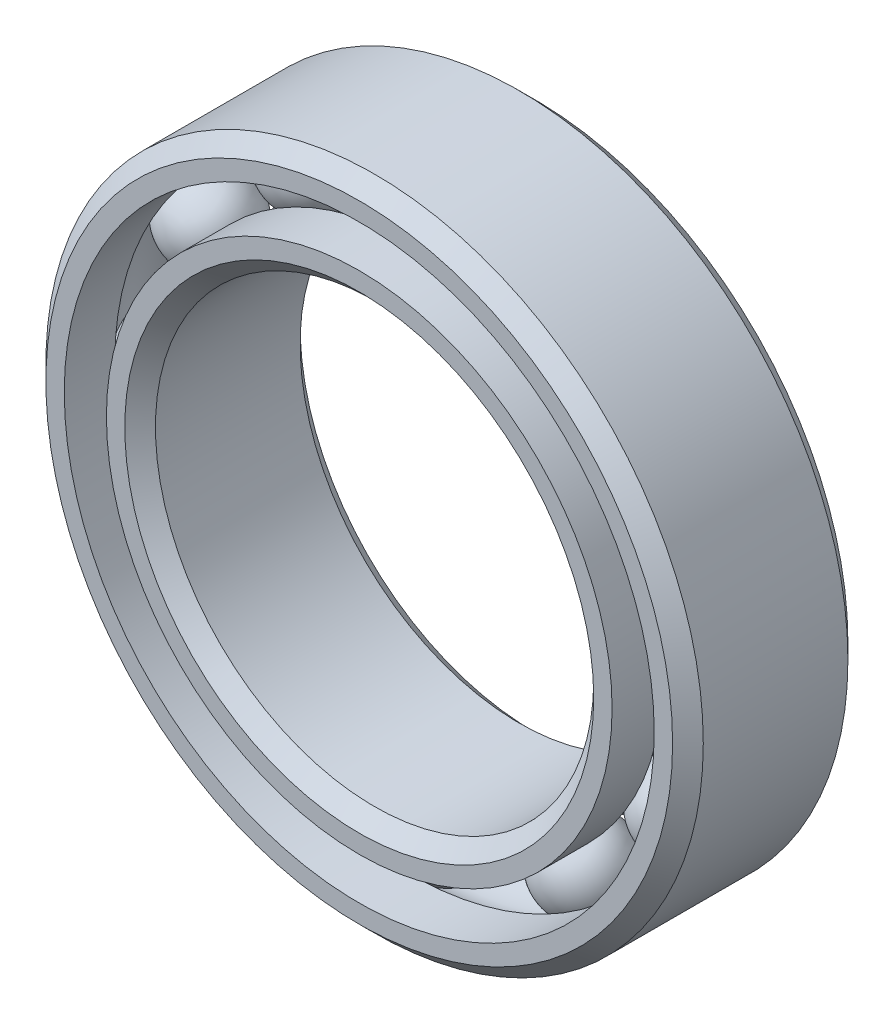
ISO-10303-21;
HEADER;
FILE_DESCRIPTION(('STEP AP214'),'2;1');
FILE_NAME('part.step','',(''),(''),'','','');
FILE_SCHEMA(('AUTOMOTIVE_DESIGN { 1 0 10303 214 1 1 1 1 }'));
ENDSEC;
DATA;
#1=APPLICATION_CONTEXT('core data for automotive mechanical design processes');
#2=APPLICATION_PROTOCOL_DEFINITION('international standard','automotive_design',2000,#1);
#3=PRODUCT_CONTEXT('',#1,'mechanical');
#4=PRODUCT('Part','Part','',(#3));
#5=PRODUCT_RELATED_PRODUCT_CATEGORY('part','',(#4));
#6=PRODUCT_DEFINITION_FORMATION('','',#4);
#7=PRODUCT_DEFINITION_CONTEXT('part definition',#1,'design');
#8=PRODUCT_DEFINITION('design','',#6,#7);
#9=PRODUCT_DEFINITION_SHAPE('','',#8);
#10=(LENGTH_UNIT() NAMED_UNIT(*) SI_UNIT(.MILLI.,.METRE.));
#11=(NAMED_UNIT(*) PLANE_ANGLE_UNIT() SI_UNIT($,.RADIAN.));
#12=(NAMED_UNIT(*) SI_UNIT($,.STERADIAN.) SOLID_ANGLE_UNIT());
#13=UNCERTAINTY_MEASURE_WITH_UNIT(LENGTH_MEASURE(1.E-05),#10,'distance_accuracy_value','');
#14=(GEOMETRIC_REPRESENTATION_CONTEXT(3) GLOBAL_UNCERTAINTY_ASSIGNED_CONTEXT((#13)) GLOBAL_UNIT_ASSIGNED_CONTEXT((#10,
#11,#12)) REPRESENTATION_CONTEXT('',''));
#15=CARTESIAN_POINT('',(0.,0.,0.));
#16=DIRECTION('',(0.,0.,1.));
#17=DIRECTION('',(1.,0.,0.));
#18=AXIS2_PLACEMENT_3D('',#15,#16,#17);
#19=CARTESIAN_POINT('',(-3.12499999999993,5.41265877365278,0.));
#20=DIRECTION('',(0.,0.,1.));
#21=DIRECTION('',(-0.499999999999989,0.866025403784445,0.));
#22=AXIS2_PLACEMENT_3D('',#19,#20,#21);
#23=SPHERICAL_SURFACE('',#22,0.975956590649587);
#24=CARTESIAN_POINT('',(-3.12499999999993,5.41265877365278,0.975956590649586));
#25=VERTEX_POINT('',#24);
#26=VERTEX_LOOP('',#25);
#27=FACE_BOUND('',#26,.T.);
#28=ADVANCED_FACE('F38',(#27),#23,.T.);
#29=CLOSED_SHELL('',(#28));
#30=MANIFOLD_SOLID_BREP('B2',#29);
#31=CARTESIAN_POINT('',(-5.4126587736527,3.12500000000006,0.));
#32=DIRECTION('',(0.,0.,1.));
#33=DIRECTION('',(-0.866025403784433,0.50000000000001,0.));
#34=AXIS2_PLACEMENT_3D('',#31,#32,#33);
#35=SPHERICAL_SURFACE('',#34,0.975956590649587);
#36=CARTESIAN_POINT('',(-5.4126587736527,3.12500000000006,0.975956590649586));
#37=VERTEX_POINT('',#36);
#38=VERTEX_LOOP('',#37);
#39=FACE_BOUND('',#38,.T.);
#40=ADVANCED_FACE('F59',(#39),#35,.T.);
#41=CLOSED_SHELL('',(#40));
#42=MANIFOLD_SOLID_BREP('B6',#41);
#43=CARTESIAN_POINT('',(-6.25,0.,0.));
#44=DIRECTION('',(0.,0.,1.));
#45=DIRECTION('',(-1.,0.,0.));
#46=AXIS2_PLACEMENT_3D('',#43,#44,#45);
#47=SPHERICAL_SURFACE('',#46,0.975956590649587);
#48=CARTESIAN_POINT('',(-6.25,0.,0.975956590649586));
#49=VERTEX_POINT('',#48);
#50=VERTEX_LOOP('',#49);
#51=FACE_BOUND('',#50,.T.);
#52=ADVANCED_FACE('F80',(#51),#47,.T.);
#53=CLOSED_SHELL('',(#52));
#54=MANIFOLD_SOLID_BREP('B34',#53);
#55=CARTESIAN_POINT('',(-5.41265877365277,-3.12499999999995,0.));
#56=DIRECTION('',(0.,0.,1.));
#57=DIRECTION('',(-0.866025403784443,-0.499999999999992,0.));
#58=AXIS2_PLACEMENT_3D('',#55,#56,#57);
#59=SPHERICAL_SURFACE('',#58,0.975956590649587);
#60=CARTESIAN_POINT('',(-5.41265877365277,-3.12499999999995,0.975956590649586));
#61=VERTEX_POINT('',#60);
#62=VERTEX_LOOP('',#61);
#63=FACE_BOUND('',#62,.T.);
#64=ADVANCED_FACE('F101',(#63),#59,.T.);
#65=CLOSED_SHELL('',(#64));
#66=MANIFOLD_SOLID_BREP('B55',#65);
#67=CARTESIAN_POINT('',(-3.12500000000004,-5.41265877365272,0.));
#68=DIRECTION('',(0.,0.,1.));
#69=DIRECTION('',(-0.500000000000007,-0.866025403784435,0.));
#70=AXIS2_PLACEMENT_3D('',#67,#68,#69);
#71=SPHERICAL_SURFACE('',#70,0.975956590649587);
#72=CARTESIAN_POINT('',(-3.12500000000004,-5.41265877365272,0.975956590649586));
#73=VERTEX_POINT('',#72);
#74=VERTEX_LOOP('',#73);
#75=FACE_BOUND('',#74,.T.);
#76=ADVANCED_FACE('F122',(#75),#71,.T.);
#77=CLOSED_SHELL('',(#76));
#78=MANIFOLD_SOLID_BREP('B76',#77);
#79=CARTESIAN_POINT('',(0.,-6.25,0.));
#80=DIRECTION('',(0.,0.,1.));
#81=DIRECTION('',(0.,-1.,0.));
#82=AXIS2_PLACEMENT_3D('',#79,#80,#81);
#83=SPHERICAL_SURFACE('',#82,0.975956590649587);
#84=CARTESIAN_POINT('',(0.,-6.25,0.975956590649586));
#85=VERTEX_POINT('',#84);
#86=VERTEX_LOOP('',#85);
#87=FACE_BOUND('',#86,.T.);
#88=ADVANCED_FACE('F143',(#87),#83,.T.);
#89=CLOSED_SHELL('',(#88));
#90=MANIFOLD_SOLID_BREP('B97',#89);
#91=CARTESIAN_POINT('',(3.12499999999997,-5.41265877365276,0.));
#92=DIRECTION('',(0.,0.,1.));
#93=DIRECTION('',(0.499999999999995,-0.866025403784442,0.));
#94=AXIS2_PLACEMENT_3D('',#91,#92,#93);
#95=SPHERICAL_SURFACE('',#94,0.975956590649587);
#96=CARTESIAN_POINT('',(3.12499999999997,-5.41265877365276,0.975956590649586));
#97=VERTEX_POINT('',#96);
#98=VERTEX_LOOP('',#97);
#99=FACE_BOUND('',#98,.T.);
#100=ADVANCED_FACE('F164',(#99),#95,.T.);
#101=CLOSED_SHELL('',(#100));
#102=MANIFOLD_SOLID_BREP('B118',#101);
#103=CARTESIAN_POINT('',(5.41265877365273,-3.12500000000003,0.));
#104=DIRECTION('',(0.,0.,1.));
#105=DIRECTION('',(0.866025403784436,-0.500000000000004,0.));
#106=AXIS2_PLACEMENT_3D('',#103,#104,#105);
#107=SPHERICAL_SURFACE('',#106,0.975956590649587);
#108=CARTESIAN_POINT('',(5.41265877365273,-3.12500000000003,0.975956590649586));
#109=VERTEX_POINT('',#108);
#110=VERTEX_LOOP('',#109);
#111=FACE_BOUND('',#110,.T.);
#112=ADVANCED_FACE('F185',(#111),#107,.T.);
#113=CLOSED_SHELL('',(#112));
#114=MANIFOLD_SOLID_BREP('B139',#113);
#115=CARTESIAN_POINT('',(6.25,0.,0.));
#116=DIRECTION('',(0.,0.,1.));
#117=DIRECTION('',(1.,0.,0.));
#118=AXIS2_PLACEMENT_3D('',#115,#116,#117);
#119=SPHERICAL_SURFACE('',#118,0.975956590649587);
#120=CARTESIAN_POINT('',(6.25,0.,0.975956590649586));
#121=VERTEX_POINT('',#120);
#122=VERTEX_LOOP('',#121);
#123=FACE_BOUND('',#122,.T.);
#124=ADVANCED_FACE('F206',(#123),#119,.T.);
#125=CLOSED_SHELL('',(#124));
#126=MANIFOLD_SOLID_BREP('B160',#125);
#127=CARTESIAN_POINT('',(5.41265877365275,3.12499999999999,0.));
#128=DIRECTION('',(0.,0.,1.));
#129=DIRECTION('',(0.86602540378444,0.499999999999998,0.));
#130=AXIS2_PLACEMENT_3D('',#127,#128,#129);
#131=SPHERICAL_SURFACE('',#130,0.975956590649587);
#132=CARTESIAN_POINT('',(5.41265877365275,3.12499999999999,0.975956590649586));
#133=VERTEX_POINT('',#132);
#134=VERTEX_LOOP('',#133);
#135=FACE_BOUND('',#134,.T.);
#136=ADVANCED_FACE('F227',(#135),#131,.T.);
#137=CLOSED_SHELL('',(#136));
#138=MANIFOLD_SOLID_BREP('B181',#137);
#139=CARTESIAN_POINT('',(3.12500000000001,5.41265877365274,0.));
#140=DIRECTION('',(0.,0.,1.));
#141=DIRECTION('',(0.500000000000001,0.866025403784438,0.));
#142=AXIS2_PLACEMENT_3D('',#139,#140,#141);
#143=SPHERICAL_SURFACE('',#142,0.975956590649587);
#144=CARTESIAN_POINT('',(3.12500000000001,5.41265877365274,0.975956590649586));
#145=VERTEX_POINT('',#144);
#146=VERTEX_LOOP('',#145);
#147=FACE_BOUND('',#146,.T.);
#148=ADVANCED_FACE('F248',(#147),#143,.T.);
#149=CLOSED_SHELL('',(#148));
#150=MANIFOLD_SOLID_BREP('B202',#149);
#151=CARTESIAN_POINT('',(0.,6.25,0.));
#152=DIRECTION('',(0.,0.,1.));
#153=DIRECTION('',(0.,1.,0.));
#154=AXIS2_PLACEMENT_3D('',#151,#152,#153);
#155=SPHERICAL_SURFACE('',#154,0.975956590649587);
#156=CARTESIAN_POINT('',(0.,6.25,0.975956590649586));
#157=VERTEX_POINT('',#156);
#158=VERTEX_LOOP('',#157);
#159=FACE_BOUND('',#158,.T.);
#160=ADVANCED_FACE('F271',(#159),#155,.T.);
#161=CLOSED_SHELL('',(#160));
#162=MANIFOLD_SOLID_BREP('B223',#161);
#163=CARTESIAN_POINT('',(0.,5.76916037011912,2.));
#164=DIRECTION('',(0.,0.,-1.));
#165=DIRECTION('',(-1.,0.,0.));
#166=AXIS2_PLACEMENT_3D('',#163,#164,#165);
#167=PLANE('',#166);
#168=CARTESIAN_POINT('',(0.,0.,2.));
#169=DIRECTION('',(0.,0.,1.));
#170=DIRECTION('',(1.,0.,0.));
#171=AXIS2_PLACEMENT_3D('',#168,#169,#170);
#172=CIRCLE('',#171,5.35);
#173=CARTESIAN_POINT('',(5.35,0.,2.));
#174=VERTEX_POINT('',#173);
#175=EDGE_CURVE('E319',#174,#174,#172,.T.);
#176=ORIENTED_EDGE('',*,*,#175,.F.);
#177=EDGE_LOOP('',(#176));
#178=FACE_BOUND('',#177,.T.);
#179=CARTESIAN_POINT('',(0.,0.,2.));
#180=DIRECTION('',(0.,0.,1.));
#181=DIRECTION('',(1.,0.,0.));
#182=AXIS2_PLACEMENT_3D('',#179,#180,#181);
#183=CIRCLE('',#182,5.76916037011912);
#184=CARTESIAN_POINT('',(5.76916037011912,0.,2.));
#185=VERTEX_POINT('',#184);
#186=EDGE_CURVE('E270',#185,#185,#183,.T.);
#187=ORIENTED_EDGE('',*,*,#186,.T.);
#188=EDGE_LOOP('',(#187));
#189=FACE_BOUND('',#188,.T.);
#190=ADVANCED_FACE('F291',(#178,#189),#167,.F.);
#191=CARTESIAN_POINT('',(0.,0.,2.));
#192=DIRECTION('',(0.,0.,1.));
#193=DIRECTION('',(1.,0.,0.));
#194=AXIS2_PLACEMENT_3D('',#191,#192,#193);
#195=CYLINDRICAL_SURFACE('',#194,5.76916037011912);
#196=ORIENTED_EDGE('',*,*,#186,.F.);
#197=EDGE_LOOP('',(#196));
#198=FACE_BOUND('',#197,.T.);
#199=CARTESIAN_POINT('',(0.,0.,0.849284709133739));
#200=DIRECTION('',(0.,0.,1.));
#201=DIRECTION('',(1.,0.,0.));
#202=AXIS2_PLACEMENT_3D('',#199,#200,#201);
#203=CIRCLE('',#202,5.76916037011912);
#204=CARTESIAN_POINT('',(5.76916037011912,0.,0.849284709133739));
#205=VERTEX_POINT('',#204);
#206=EDGE_CURVE('E297',#205,#205,#203,.T.);
#207=ORIENTED_EDGE('',*,*,#206,.T.);
#208=EDGE_LOOP('',(#207));
#209=FACE_BOUND('',#208,.T.);
#210=ADVANCED_FACE('F326',(#198,#209),#195,.T.);
#211=CARTESIAN_POINT('',(0.,0.,0.));
#212=DIRECTION('',(0.,0.,1.));
#213=DIRECTION('',(1.,0.,0.));
#214=AXIS2_PLACEMENT_3D('',#211,#212,#213);
#215=TOROIDAL_SURFACE('',#214,6.25,0.975956590649584);
#216=ORIENTED_EDGE('',*,*,#206,.F.);
#217=EDGE_LOOP('',(#216));
#218=FACE_BOUND('',#217,.T.);
#219=CARTESIAN_POINT('',(0.,0.,-0.849284709133742));
#220=DIRECTION('',(0.,0.,1.));
#221=DIRECTION('',(1.,0.,0.));
#222=AXIS2_PLACEMENT_3D('',#219,#220,#221);
#223=CIRCLE('',#222,5.76916037011912);
#224=CARTESIAN_POINT('',(5.76916037011912,0.,-0.849284709133742));
#225=VERTEX_POINT('',#224);
#226=EDGE_CURVE('E301',#225,#225,#223,.T.);
#227=ORIENTED_EDGE('',*,*,#226,.T.);
#228=EDGE_LOOP('',(#227));
#229=FACE_BOUND('',#228,.T.);
#230=ADVANCED_FACE('F330',(#218,#229),#215,.F.);
#231=CARTESIAN_POINT('',(0.,0.,2.));
#232=DIRECTION('',(0.,0.,1.));
#233=DIRECTION('',(1.,0.,0.));
#234=AXIS2_PLACEMENT_3D('',#231,#232,#233);
#235=CYLINDRICAL_SURFACE('',#234,5.76916037011912);
#236=ORIENTED_EDGE('',*,*,#226,.F.);
#237=EDGE_LOOP('',(#236));
#238=FACE_BOUND('',#237,.T.);
#239=CARTESIAN_POINT('',(0.,0.,-2.));
#240=DIRECTION('',(0.,0.,1.));
#241=DIRECTION('',(1.,0.,0.));
#242=AXIS2_PLACEMENT_3D('',#239,#240,#241);
#243=CIRCLE('',#242,5.76916037011912);
#244=CARTESIAN_POINT('',(5.76916037011912,0.,-2.));
#245=VERTEX_POINT('',#244);
#246=EDGE_CURVE('E305',#245,#245,#243,.T.);
#247=ORIENTED_EDGE('',*,*,#246,.T.);
#248=EDGE_LOOP('',(#247));
#249=FACE_BOUND('',#248,.T.);
#250=ADVANCED_FACE('F335',(#238,#249),#235,.T.);
#251=CARTESIAN_POINT('',(0.,5.35,-2.));
#252=DIRECTION('',(0.,0.,1.));
#253=DIRECTION('',(1.,0.,0.));
#254=AXIS2_PLACEMENT_3D('',#251,#252,#253);
#255=PLANE('',#254);
#256=ORIENTED_EDGE('',*,*,#246,.F.);
#257=EDGE_LOOP('',(#256));
#258=FACE_BOUND('',#257,.T.);
#259=CARTESIAN_POINT('',(0.,0.,-2.));
#260=DIRECTION('',(0.,0.,1.));
#261=DIRECTION('',(1.,0.,0.));
#262=AXIS2_PLACEMENT_3D('',#259,#260,#261);
#263=CIRCLE('',#262,5.35);
#264=CARTESIAN_POINT('',(5.35,0.,-2.));
#265=VERTEX_POINT('',#264);
#266=EDGE_CURVE('E310',#265,#265,#263,.T.);
#267=ORIENTED_EDGE('',*,*,#266,.T.);
#268=EDGE_LOOP('',(#267));
#269=FACE_BOUND('',#268,.T.);
#270=ADVANCED_FACE('F341',(#258,#269),#255,.F.);
#271=CARTESIAN_POINT('',(0.,0.,-1.65));
#272=DIRECTION('',(0.,0.,-1.));
#273=DIRECTION('',(-1.,0.,0.));
#274=AXIS2_PLACEMENT_3D('',#271,#272,#273);
#275=CONICAL_SURFACE('',#274,5.,0.785398163397447);
#276=ORIENTED_EDGE('',*,*,#266,.F.);
#277=EDGE_LOOP('',(#276));
#278=FACE_BOUND('',#277,.T.);
#279=CARTESIAN_POINT('',(0.,0.,-1.65));
#280=DIRECTION('',(0.,0.,1.));
#281=DIRECTION('',(1.,0.,0.));
#282=AXIS2_PLACEMENT_3D('',#279,#280,#281);
#283=CIRCLE('',#282,5.);
#284=CARTESIAN_POINT('',(5.,0.,-1.65));
#285=VERTEX_POINT('',#284);
#286=EDGE_CURVE('E313',#285,#285,#283,.T.);
#287=ORIENTED_EDGE('',*,*,#286,.T.);
#288=EDGE_LOOP('',(#287));
#289=FACE_BOUND('',#288,.T.);
#290=ADVANCED_FACE('F345',(#278,#289),#275,.F.);
#291=CARTESIAN_POINT('',(0.,0.,2.));
#292=DIRECTION('',(0.,0.,1.));
#293=DIRECTION('',(1.,0.,0.));
#294=AXIS2_PLACEMENT_3D('',#291,#292,#293);
#295=CYLINDRICAL_SURFACE('',#294,5.);
#296=ORIENTED_EDGE('',*,*,#286,.F.);
#297=EDGE_LOOP('',(#296));
#298=FACE_BOUND('',#297,.T.);
#299=CARTESIAN_POINT('',(0.,0.,1.65));
#300=DIRECTION('',(0.,0.,1.));
#301=DIRECTION('',(1.,0.,0.));
#302=AXIS2_PLACEMENT_3D('',#299,#300,#301);
#303=CIRCLE('',#302,5.);
#304=CARTESIAN_POINT('',(5.,0.,1.65));
#305=VERTEX_POINT('',#304);
#306=EDGE_CURVE('E316',#305,#305,#303,.T.);
#307=ORIENTED_EDGE('',*,*,#306,.T.);
#308=EDGE_LOOP('',(#307));
#309=FACE_BOUND('',#308,.T.);
#310=ADVANCED_FACE('F349',(#298,#309),#295,.F.);
#311=CARTESIAN_POINT('',(0.,0.,2.));
#312=DIRECTION('',(0.,0.,1.));
#313=DIRECTION('',(1.,0.,0.));
#314=AXIS2_PLACEMENT_3D('',#311,#312,#313);
#315=CONICAL_SURFACE('',#314,5.35,0.78539816339745);
#316=ORIENTED_EDGE('',*,*,#306,.F.);
#317=EDGE_LOOP('',(#316));
#318=FACE_BOUND('',#317,.T.);
#319=ORIENTED_EDGE('',*,*,#175,.T.);
#320=EDGE_LOOP('',(#319));
#321=FACE_BOUND('',#320,.T.);
#322=ADVANCED_FACE('F323',(#318,#321),#315,.F.);
#323=CLOSED_SHELL('',(#190,#210,#230,#250,#270,#290,#310,#322));
#324=MANIFOLD_SOLID_BREP('B244',#323);
#325=CARTESIAN_POINT('',(0.,0.,1.65));
#326=DIRECTION('',(0.,0.,-1.));
#327=DIRECTION('',(-1.,0.,0.));
#328=AXIS2_PLACEMENT_3D('',#325,#326,#327);
#329=CONICAL_SURFACE('',#328,7.5,0.785398163397445);
#330=CARTESIAN_POINT('',(0.,0.,2.));
#331=DIRECTION('',(0.,0.,1.));
#332=DIRECTION('',(1.,0.,0.));
#333=AXIS2_PLACEMENT_3D('',#330,#331,#332);
#334=CIRCLE('',#333,7.15);
#335=CARTESIAN_POINT('',(7.15,0.,2.));
#336=VERTEX_POINT('',#335);
#337=EDGE_CURVE('E441',#336,#336,#334,.T.);
#338=ORIENTED_EDGE('',*,*,#337,.F.);
#339=EDGE_LOOP('',(#338));
#340=FACE_BOUND('',#339,.T.);
#341=CARTESIAN_POINT('',(0.,0.,1.65));
#342=DIRECTION('',(0.,0.,1.));
#343=DIRECTION('',(1.,0.,0.));
#344=AXIS2_PLACEMENT_3D('',#341,#342,#343);
#345=CIRCLE('',#344,7.5);
#346=CARTESIAN_POINT('',(7.5,0.,1.65));
#347=VERTEX_POINT('',#346);
#348=EDGE_CURVE('E290',#347,#347,#345,.T.);
#349=ORIENTED_EDGE('',*,*,#348,.T.);
#350=EDGE_LOOP('',(#349));
#351=FACE_BOUND('',#350,.T.);
#352=ADVANCED_FACE('F413',(#340,#351),#329,.T.);
#353=CARTESIAN_POINT('',(0.,0.,2.));
#354=DIRECTION('',(0.,0.,1.));
#355=DIRECTION('',(1.,0.,0.));
#356=AXIS2_PLACEMENT_3D('',#353,#354,#355);
#357=CYLINDRICAL_SURFACE('',#356,7.5);
#358=ORIENTED_EDGE('',*,*,#348,.F.);
#359=EDGE_LOOP('',(#358));
#360=FACE_BOUND('',#359,.T.);
#361=CARTESIAN_POINT('',(0.,0.,-1.65));
#362=DIRECTION('',(0.,0.,1.));
#363=DIRECTION('',(1.,0.,0.));
#364=AXIS2_PLACEMENT_3D('',#361,#362,#363);
#365=CIRCLE('',#364,7.5);
#366=CARTESIAN_POINT('',(7.5,0.,-1.65));
#367=VERTEX_POINT('',#366);
#368=EDGE_CURVE('E419',#367,#367,#365,.T.);
#369=ORIENTED_EDGE('',*,*,#368,.T.);
#370=EDGE_LOOP('',(#369));
#371=FACE_BOUND('',#370,.T.);
#372=ADVANCED_FACE('F448',(#360,#371),#357,.T.);
#373=CARTESIAN_POINT('',(0.,0.,-2.));
#374=DIRECTION('',(0.,0.,1.));
#375=DIRECTION('',(1.,0.,0.));
#376=AXIS2_PLACEMENT_3D('',#373,#374,#375);
#377=CONICAL_SURFACE('',#376,7.15,0.785398163397443);
#378=ORIENTED_EDGE('',*,*,#368,.F.);
#379=EDGE_LOOP('',(#378));
#380=FACE_BOUND('',#379,.T.);
#381=CARTESIAN_POINT('',(0.,0.,-2.));
#382=DIRECTION('',(0.,0.,1.));
#383=DIRECTION('',(1.,0.,0.));
#384=AXIS2_PLACEMENT_3D('',#381,#382,#383);
#385=CIRCLE('',#384,7.15);
#386=CARTESIAN_POINT('',(7.15,0.,-2.));
#387=VERTEX_POINT('',#386);
#388=EDGE_CURVE('E423',#387,#387,#385,.T.);
#389=ORIENTED_EDGE('',*,*,#388,.T.);
#390=EDGE_LOOP('',(#389));
#391=FACE_BOUND('',#390,.T.);
#392=ADVANCED_FACE('F452',(#380,#391),#377,.T.);
#393=CARTESIAN_POINT('',(0.,7.15,-2.));
#394=DIRECTION('',(0.,0.,1.));
#395=DIRECTION('',(1.,0.,0.));
#396=AXIS2_PLACEMENT_3D('',#393,#394,#395);
#397=PLANE('',#396);
#398=ORIENTED_EDGE('',*,*,#388,.F.);
#399=EDGE_LOOP('',(#398));
#400=FACE_BOUND('',#399,.T.);
#401=CARTESIAN_POINT('',(0.,0.,-2.00000000000001));
#402=DIRECTION('',(0.,0.,1.));
#403=DIRECTION('',(1.,0.,0.));
#404=AXIS2_PLACEMENT_3D('',#401,#402,#403);
#405=CIRCLE('',#404,6.73083962988088);
#406=CARTESIAN_POINT('',(6.73083962988088,0.,-2.00000000000001));
#407=VERTEX_POINT('',#406);
#408=EDGE_CURVE('E427',#407,#407,#405,.T.);
#409=ORIENTED_EDGE('',*,*,#408,.T.);
#410=EDGE_LOOP('',(#409));
#411=FACE_BOUND('',#410,.T.);
#412=ADVANCED_FACE('F457',(#400,#411),#397,.F.);
#413=CARTESIAN_POINT('',(0.,0.,2.));
#414=DIRECTION('',(0.,0.,1.));
#415=DIRECTION('',(1.,0.,0.));
#416=AXIS2_PLACEMENT_3D('',#413,#414,#415);
#417=CYLINDRICAL_SURFACE('',#416,6.73083962988088);
#418=ORIENTED_EDGE('',*,*,#408,.F.);
#419=EDGE_LOOP('',(#418));
#420=FACE_BOUND('',#419,.T.);
#421=CARTESIAN_POINT('',(0.,0.,-0.849284709133745));
#422=DIRECTION('',(0.,0.,1.));
#423=DIRECTION('',(1.,0.,0.));
#424=AXIS2_PLACEMENT_3D('',#421,#422,#423);
#425=CIRCLE('',#424,6.73083962988088);
#426=CARTESIAN_POINT('',(6.73083962988088,0.,-0.849284709133745));
#427=VERTEX_POINT('',#426);
#428=EDGE_CURVE('E432',#427,#427,#425,.T.);
#429=ORIENTED_EDGE('',*,*,#428,.T.);
#430=EDGE_LOOP('',(#429));
#431=FACE_BOUND('',#430,.T.);
#432=ADVANCED_FACE('F463',(#420,#431),#417,.F.);
#433=CARTESIAN_POINT('',(0.,0.,0.));
#434=DIRECTION('',(0.,0.,1.));
#435=DIRECTION('',(1.,0.,0.));
#436=AXIS2_PLACEMENT_3D('',#433,#434,#435);
#437=TOROIDAL_SURFACE('',#436,6.25,0.975956590649587);
#438=ORIENTED_EDGE('',*,*,#428,.F.);
#439=EDGE_LOOP('',(#438));
#440=FACE_BOUND('',#439,.T.);
#441=CARTESIAN_POINT('',(0.,0.,0.849284709133741));
#442=DIRECTION('',(0.,0.,1.));
#443=DIRECTION('',(1.,0.,0.));
#444=AXIS2_PLACEMENT_3D('',#441,#442,#443);
#445=CIRCLE('',#444,6.73083962988088);
#446=CARTESIAN_POINT('',(6.73083962988088,0.,0.849284709133741));
#447=VERTEX_POINT('',#446);
#448=EDGE_CURVE('E435',#447,#447,#445,.T.);
#449=ORIENTED_EDGE('',*,*,#448,.T.);
#450=EDGE_LOOP('',(#449));
#451=FACE_BOUND('',#450,.T.);
#452=ADVANCED_FACE('F467',(#440,#451),#437,.F.);
#453=CARTESIAN_POINT('',(0.,0.,2.));
#454=DIRECTION('',(0.,0.,1.));
#455=DIRECTION('',(1.,0.,0.));
#456=AXIS2_PLACEMENT_3D('',#453,#454,#455);
#457=CYLINDRICAL_SURFACE('',#456,6.73083962988088);
#458=ORIENTED_EDGE('',*,*,#448,.F.);
#459=EDGE_LOOP('',(#458));
#460=FACE_BOUND('',#459,.T.);
#461=CARTESIAN_POINT('',(0.,0.,2.));
#462=DIRECTION('',(0.,0.,1.));
#463=DIRECTION('',(1.,0.,0.));
#464=AXIS2_PLACEMENT_3D('',#461,#462,#463);
#465=CIRCLE('',#464,6.73083962988088);
#466=CARTESIAN_POINT('',(6.73083962988088,0.,2.));
#467=VERTEX_POINT('',#466);
#468=EDGE_CURVE('E438',#467,#467,#465,.T.);
#469=ORIENTED_EDGE('',*,*,#468,.T.);
#470=EDGE_LOOP('',(#469));
#471=FACE_BOUND('',#470,.T.);
#472=ADVANCED_FACE('F471',(#460,#471),#457,.F.);
#473=CARTESIAN_POINT('',(0.,7.15,2.));
#474=DIRECTION('',(0.,0.,-1.));
#475=DIRECTION('',(-1.,0.,0.));
#476=AXIS2_PLACEMENT_3D('',#473,#474,#475);
#477=PLANE('',#476);
#478=ORIENTED_EDGE('',*,*,#468,.F.);
#479=EDGE_LOOP('',(#478));
#480=FACE_BOUND('',#479,.T.);
#481=ORIENTED_EDGE('',*,*,#337,.T.);
#482=EDGE_LOOP('',(#481));
#483=FACE_BOUND('',#482,.T.);
#484=ADVANCED_FACE('F445',(#480,#483),#477,.F.);
#485=CLOSED_SHELL('',(#352,#372,#392,#412,#432,#452,#472,#484));
#486=MANIFOLD_SOLID_BREP('B265',#485);
#487=ADVANCED_BREP_SHAPE_REPRESENTATION('',(#18,#30,#42,#54,#66,#78,#90,#102,#114,#126,#138,
#150,#162,#324,#486),#14);
#488=SHAPE_DEFINITION_REPRESENTATION(#9,#487);
ENDSEC;
END-ISO-10303-21;
